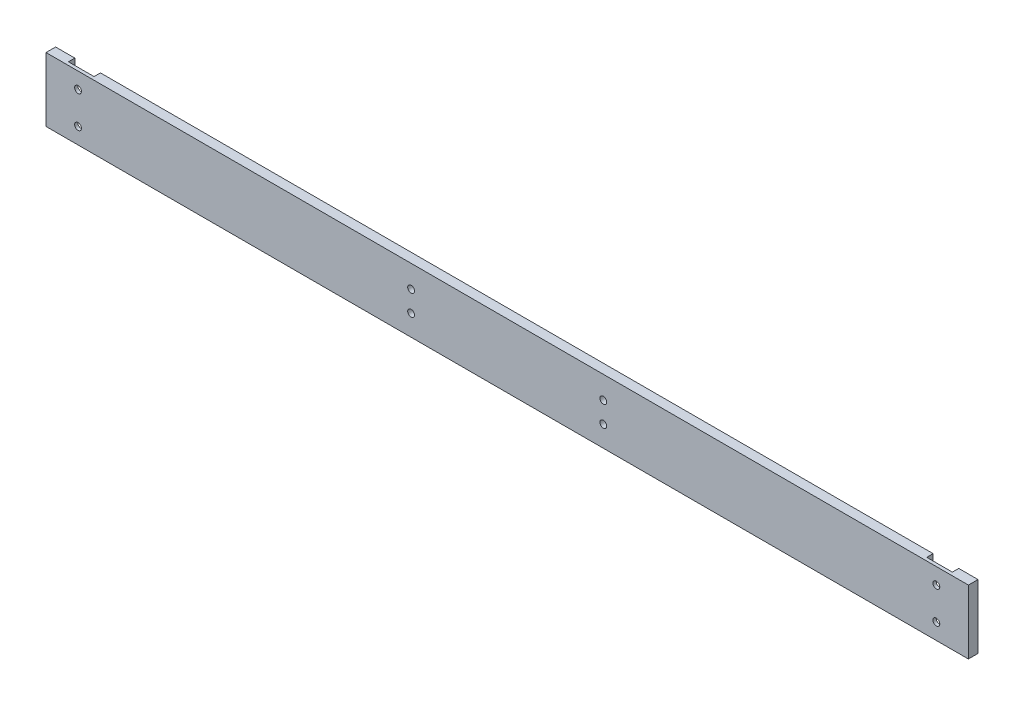
ISO-10303-21;
HEADER;
FILE_DESCRIPTION(('STEP AP214'),'2;1');
FILE_NAME('part.step','',(''),(''),'','','');
FILE_SCHEMA(('AUTOMOTIVE_DESIGN { 1 0 10303 214 1 1 1 1 }'));
ENDSEC;
DATA;
#1=APPLICATION_CONTEXT('core data for automotive mechanical design processes');
#2=APPLICATION_PROTOCOL_DEFINITION('international standard','automotive_design',2000,#1);
#3=PRODUCT_CONTEXT('',#1,'mechanical');
#4=PRODUCT('Part','Part','',(#3));
#5=PRODUCT_RELATED_PRODUCT_CATEGORY('part','',(#4));
#6=PRODUCT_DEFINITION_FORMATION('','',#4);
#7=PRODUCT_DEFINITION_CONTEXT('part definition',#1,'design');
#8=PRODUCT_DEFINITION('design','',#6,#7);
#9=PRODUCT_DEFINITION_SHAPE('','',#8);
#10=(LENGTH_UNIT() NAMED_UNIT(*) SI_UNIT(.MILLI.,.METRE.));
#11=(NAMED_UNIT(*) PLANE_ANGLE_UNIT() SI_UNIT($,.RADIAN.));
#12=(NAMED_UNIT(*) SI_UNIT($,.STERADIAN.) SOLID_ANGLE_UNIT());
#13=UNCERTAINTY_MEASURE_WITH_UNIT(LENGTH_MEASURE(1.E-05),#10,'distance_accuracy_value','');
#14=(GEOMETRIC_REPRESENTATION_CONTEXT(3) GLOBAL_UNCERTAINTY_ASSIGNED_CONTEXT((#13)) GLOBAL_UNIT_ASSIGNED_CONTEXT((#10,
#11,#12)) REPRESENTATION_CONTEXT('',''));
#15=CARTESIAN_POINT('',(0.,0.,0.));
#16=DIRECTION('',(0.,0.,1.));
#17=DIRECTION('',(1.,0.,0.));
#18=AXIS2_PLACEMENT_3D('',#15,#16,#17);
#19=CARTESIAN_POINT('',(-457.2,63.5,0.));
#20=DIRECTION('',(0.,0.,-1.));
#21=DIRECTION('',(-1.,0.,0.));
#22=AXIS2_PLACEMENT_3D('',#19,#20,#21);
#23=PLANE('',#22);
#24=CARTESIAN_POINT('',(-425.45,47.625,0.));
#25=DIRECTION('',(0.,0.,1.));
#26=DIRECTION('',(1.,0.,0.));
#27=AXIS2_PLACEMENT_3D('',#24,#25,#26);
#28=CIRCLE('',#27,3.3782);
#29=CARTESIAN_POINT('',(-422.0718,47.625,0.));
#30=VERTEX_POINT('',#29);
#31=EDGE_CURVE('E457',#30,#30,#28,.T.);
#32=ORIENTED_EDGE('',*,*,#31,.F.);
#33=EDGE_LOOP('',(#32));
#34=FACE_BOUND('',#33,.T.);
#35=CARTESIAN_POINT('',(425.45,15.875,0.));
#36=DIRECTION('',(0.,0.,1.));
#37=DIRECTION('',(1.,0.,0.));
#38=AXIS2_PLACEMENT_3D('',#35,#36,#37);
#39=CIRCLE('',#38,3.3782);
#40=CARTESIAN_POINT('',(428.8282,15.875,0.));
#41=VERTEX_POINT('',#40);
#42=EDGE_CURVE('E154',#41,#41,#39,.T.);
#43=ORIENTED_EDGE('',*,*,#42,.F.);
#44=EDGE_LOOP('',(#43));
#45=FACE_BOUND('',#44,.T.);
#46=CARTESIAN_POINT('',(-95.25,41.275,0.));
#47=DIRECTION('',(0.,0.,1.));
#48=DIRECTION('',(1.,0.,0.));
#49=AXIS2_PLACEMENT_3D('',#46,#47,#48);
#50=CIRCLE('',#49,3.37819999999998);
#51=CARTESIAN_POINT('',(-91.8718,41.275,0.));
#52=VERTEX_POINT('',#51);
#53=EDGE_CURVE('E160',#52,#52,#50,.T.);
#54=ORIENTED_EDGE('',*,*,#53,.F.);
#55=EDGE_LOOP('',(#54));
#56=FACE_BOUND('',#55,.T.);
#57=CARTESIAN_POINT('',(-95.25,20.6375,0.));
#58=DIRECTION('',(0.,0.,1.));
#59=DIRECTION('',(1.,0.,0.));
#60=AXIS2_PLACEMENT_3D('',#57,#58,#59);
#61=CIRCLE('',#60,3.37819999999998);
#62=CARTESIAN_POINT('',(-91.8718,20.6375,0.));
#63=VERTEX_POINT('',#62);
#64=EDGE_CURVE('E166',#63,#63,#61,.T.);
#65=ORIENTED_EDGE('',*,*,#64,.F.);
#66=EDGE_LOOP('',(#65));
#67=FACE_BOUND('',#66,.T.);
#68=CARTESIAN_POINT('',(95.25,41.275,0.));
#69=DIRECTION('',(0.,0.,1.));
#70=DIRECTION('',(1.,0.,0.));
#71=AXIS2_PLACEMENT_3D('',#68,#69,#70);
#72=CIRCLE('',#71,3.37819999999998);
#73=CARTESIAN_POINT('',(98.6282,41.275,0.));
#74=VERTEX_POINT('',#73);
#75=EDGE_CURVE('E172',#74,#74,#72,.T.);
#76=ORIENTED_EDGE('',*,*,#75,.F.);
#77=EDGE_LOOP('',(#76));
#78=FACE_BOUND('',#77,.T.);
#79=CARTESIAN_POINT('',(95.25,20.6375,0.));
#80=DIRECTION('',(0.,0.,1.));
#81=DIRECTION('',(1.,0.,0.));
#82=AXIS2_PLACEMENT_3D('',#79,#80,#81);
#83=CIRCLE('',#82,3.37819999999998);
#84=CARTESIAN_POINT('',(98.6282,20.6375,0.));
#85=VERTEX_POINT('',#84);
#86=EDGE_CURVE('E178',#85,#85,#83,.T.);
#87=ORIENTED_EDGE('',*,*,#86,.F.);
#88=EDGE_LOOP('',(#87));
#89=FACE_BOUND('',#88,.T.);
#90=CARTESIAN_POINT('',(425.45,47.625,0.));
#91=DIRECTION('',(0.,0.,1.));
#92=DIRECTION('',(1.,0.,0.));
#93=AXIS2_PLACEMENT_3D('',#90,#91,#92);
#94=CIRCLE('',#93,3.3782);
#95=CARTESIAN_POINT('',(428.8282,47.625,0.));
#96=VERTEX_POINT('',#95);
#97=EDGE_CURVE('E184',#96,#96,#94,.T.);
#98=ORIENTED_EDGE('',*,*,#97,.F.);
#99=EDGE_LOOP('',(#98));
#100=FACE_BOUND('',#99,.T.);
#101=DIRECTION('',(1.,0.,0.));
#102=VECTOR('',#101,1.);
#103=CARTESIAN_POINT('',(-457.2,0.,0.));
#104=LINE('',#103,#102);
#105=CARTESIAN_POINT('',(-457.2,0.,0.));
#106=VERTEX_POINT('',#105);
#107=CARTESIAN_POINT('',(457.2,0.,0.));
#108=VERTEX_POINT('',#107);
#109=EDGE_CURVE('E219',#106,#108,#104,.T.);
#110=ORIENTED_EDGE('',*,*,#109,.T.);
#111=DIRECTION('',(0.,-1.,0.));
#112=VECTOR('',#111,1.);
#113=CARTESIAN_POINT('',(457.2,63.5,0.));
#114=LINE('',#113,#112);
#115=CARTESIAN_POINT('',(457.2,63.5,0.));
#116=VERTEX_POINT('',#115);
#117=EDGE_CURVE('E44',#116,#108,#114,.T.);
#118=ORIENTED_EDGE('',*,*,#117,.F.);
#119=DIRECTION('',(1.,0.,0.));
#120=VECTOR('',#119,1.);
#121=CARTESIAN_POINT('',(-457.2,63.5,0.));
#122=LINE('',#121,#120);
#123=CARTESIAN_POINT('',(-457.2,63.5,0.));
#124=VERTEX_POINT('',#123);
#125=EDGE_CURVE('E227',#124,#116,#122,.T.);
#126=ORIENTED_EDGE('',*,*,#125,.F.);
#127=DIRECTION('',(0.,-1.,0.));
#128=VECTOR('',#127,1.);
#129=CARTESIAN_POINT('',(-457.2,63.5,0.));
#130=LINE('',#129,#128);
#131=EDGE_CURVE('E11',#124,#106,#130,.T.);
#132=ORIENTED_EDGE('',*,*,#131,.T.);
#133=EDGE_LOOP('',(#110,#118,#126,#132));
#134=FACE_BOUND('',#133,.T.);
#135=CARTESIAN_POINT('',(-425.45,15.875,0.));
#136=DIRECTION('',(0.,0.,1.));
#137=DIRECTION('',(1.,0.,0.));
#138=AXIS2_PLACEMENT_3D('',#135,#136,#137);
#139=CIRCLE('',#138,3.3782);
#140=CARTESIAN_POINT('',(-422.0718,15.875,0.));
#141=VERTEX_POINT('',#140);
#142=EDGE_CURVE('E453',#141,#141,#139,.T.);
#143=ORIENTED_EDGE('',*,*,#142,.F.);
#144=EDGE_LOOP('',(#143));
#145=FACE_BOUND('',#144,.T.);
#146=ADVANCED_FACE('F35',(#34,#45,#56,#67,#78,#89,#100,#134,#145),#23,.F.);
#147=CARTESIAN_POINT('',(-457.2,63.5,-9.52500000000001));
#148=DIRECTION('',(0.,0.,-1.));
#149=DIRECTION('',(-1.,0.,0.));
#150=AXIS2_PLACEMENT_3D('',#147,#148,#149);
#151=PLANE('',#150);
#152=CARTESIAN_POINT('',(-95.25,41.275,-9.52500000000001));
#153=DIRECTION('',(0.,0.,1.));
#154=DIRECTION('',(1.,0.,0.));
#155=AXIS2_PLACEMENT_3D('',#152,#153,#154);
#156=CIRCLE('',#155,3.37819999999997);
#157=CARTESIAN_POINT('',(-91.8718,41.275,-9.52500000000001));
#158=VERTEX_POINT('',#157);
#159=EDGE_CURVE('E163',#158,#158,#156,.T.);
#160=ORIENTED_EDGE('',*,*,#159,.T.);
#161=EDGE_LOOP('',(#160));
#162=FACE_BOUND('',#161,.T.);
#163=CARTESIAN_POINT('',(-95.25,20.6375,-9.52500000000001));
#164=DIRECTION('',(0.,0.,1.));
#165=DIRECTION('',(1.,0.,0.));
#166=AXIS2_PLACEMENT_3D('',#163,#164,#165);
#167=CIRCLE('',#166,3.37819999999997);
#168=CARTESIAN_POINT('',(-91.8718,20.6375,-9.52500000000001));
#169=VERTEX_POINT('',#168);
#170=EDGE_CURVE('E169',#169,#169,#167,.T.);
#171=ORIENTED_EDGE('',*,*,#170,.T.);
#172=EDGE_LOOP('',(#171));
#173=FACE_BOUND('',#172,.T.);
#174=CARTESIAN_POINT('',(95.25,41.275,-9.52500000000001));
#175=DIRECTION('',(0.,0.,1.));
#176=DIRECTION('',(1.,0.,0.));
#177=AXIS2_PLACEMENT_3D('',#174,#175,#176);
#178=CIRCLE('',#177,3.37819999999997);
#179=CARTESIAN_POINT('',(98.6282,41.275,-9.52500000000001));
#180=VERTEX_POINT('',#179);
#181=EDGE_CURVE('E175',#180,#180,#178,.T.);
#182=ORIENTED_EDGE('',*,*,#181,.T.);
#183=EDGE_LOOP('',(#182));
#184=FACE_BOUND('',#183,.T.);
#185=CARTESIAN_POINT('',(95.25,20.6375,-9.52500000000001));
#186=DIRECTION('',(0.,0.,1.));
#187=DIRECTION('',(1.,0.,0.));
#188=AXIS2_PLACEMENT_3D('',#185,#186,#187);
#189=CIRCLE('',#188,3.37819999999997);
#190=CARTESIAN_POINT('',(98.6282,20.6375,-9.52500000000001));
#191=VERTEX_POINT('',#190);
#192=EDGE_CURVE('E181',#191,#191,#189,.T.);
#193=ORIENTED_EDGE('',*,*,#192,.T.);
#194=EDGE_LOOP('',(#193));
#195=FACE_BOUND('',#194,.T.);
#196=DIRECTION('',(1.,0.,0.));
#197=VECTOR('',#196,1.);
#198=CARTESIAN_POINT('',(-457.2,0.,-9.52500000000001));
#199=LINE('',#198,#197);
#200=CARTESIAN_POINT('',(-412.75,0.,-9.525));
#201=VERTEX_POINT('',#200);
#202=CARTESIAN_POINT('',(412.75,0.,-9.525));
#203=VERTEX_POINT('',#202);
#204=EDGE_CURVE('E234',#201,#203,#199,.T.);
#205=ORIENTED_EDGE('',*,*,#204,.F.);
#206=DIRECTION('',(0.,1.,0.));
#207=VECTOR('',#206,1.);
#208=CARTESIAN_POINT('',(-412.75,0.,-9.525));
#209=LINE('',#208,#207);
#210=CARTESIAN_POINT('',(-412.75,63.5,-9.525));
#211=VERTEX_POINT('',#210);
#212=EDGE_CURVE('E268',#201,#211,#209,.T.);
#213=ORIENTED_EDGE('',*,*,#212,.T.);
#214=DIRECTION('',(1.,0.,0.));
#215=VECTOR('',#214,1.);
#216=CARTESIAN_POINT('',(-457.2,63.5,-9.52500000000001));
#217=LINE('',#216,#215);
#218=CARTESIAN_POINT('',(412.75,63.5,-9.525));
#219=VERTEX_POINT('',#218);
#220=EDGE_CURVE('E224',#211,#219,#217,.T.);
#221=ORIENTED_EDGE('',*,*,#220,.T.);
#222=DIRECTION('',(0.,1.,0.));
#223=VECTOR('',#222,1.);
#224=CARTESIAN_POINT('',(412.75,0.,-9.525));
#225=LINE('',#224,#223);
#226=EDGE_CURVE('E190',#203,#219,#225,.T.);
#227=ORIENTED_EDGE('',*,*,#226,.F.);
#228=EDGE_LOOP('',(#205,#213,#221,#227));
#229=FACE_BOUND('',#228,.T.);
#230=ADVANCED_FACE('F276',(#162,#173,#184,#195,#229),#151,.T.);
#231=CARTESIAN_POINT('',(-457.2,63.5,-9.52500000000001));
#232=VERTEX_POINT('',#231);
#233=CARTESIAN_POINT('',(-438.15,63.5,-9.525));
#234=VERTEX_POINT('',#233);
#235=EDGE_CURVE('E220',#232,#234,#217,.T.);
#236=ORIENTED_EDGE('',*,*,#235,.T.);
#237=DIRECTION('',(0.,-1.,0.));
#238=VECTOR('',#237,1.);
#239=CARTESIAN_POINT('',(-438.15,0.,-9.525));
#240=LINE('',#239,#238);
#241=CARTESIAN_POINT('',(-438.15,0.,-9.525));
#242=VERTEX_POINT('',#241);
#243=EDGE_CURVE('E250',#234,#242,#240,.T.);
#244=ORIENTED_EDGE('',*,*,#243,.T.);
#245=CARTESIAN_POINT('',(-457.2,0.,-9.52500000000001));
#246=VERTEX_POINT('',#245);
#247=EDGE_CURVE('E146',#246,#242,#199,.T.);
#248=ORIENTED_EDGE('',*,*,#247,.F.);
#249=DIRECTION('',(0.,-1.,0.));
#250=VECTOR('',#249,1.);
#251=CARTESIAN_POINT('',(-457.2,63.5,-9.52500000000001));
#252=LINE('',#251,#250);
#253=EDGE_CURVE('E39',#232,#246,#252,.T.);
#254=ORIENTED_EDGE('',*,*,#253,.F.);
#255=EDGE_LOOP('',(#236,#244,#248,#254));
#256=FACE_BOUND('',#255,.T.);
#257=ADVANCED_FACE('F249',(#256),#151,.T.);
#258=CARTESIAN_POINT('',(0.,63.5,0.));
#259=DIRECTION('',(0.,-1.,0.));
#260=DIRECTION('',(0.,0.,-1.));
#261=AXIS2_PLACEMENT_3D('',#258,#259,#260);
#262=PLANE('',#261);
#263=DIRECTION('',(0.,0.,-1.));
#264=VECTOR('',#263,1.);
#265=CARTESIAN_POINT('',(-412.75,63.5,-3.175));
#266=LINE('',#265,#264);
#267=CARTESIAN_POINT('',(-412.75,63.5,-3.175));
#268=VERTEX_POINT('',#267);
#269=EDGE_CURVE('E149',#268,#211,#266,.T.);
#270=ORIENTED_EDGE('',*,*,#269,.F.);
#271=DIRECTION('',(-1.,0.,0.));
#272=VECTOR('',#271,1.);
#273=CARTESIAN_POINT('',(-412.75,63.5,-3.175));
#274=LINE('',#273,#272);
#275=CARTESIAN_POINT('',(-438.15,63.5,-3.175));
#276=VERTEX_POINT('',#275);
#277=EDGE_CURVE('E134',#268,#276,#274,.T.);
#278=ORIENTED_EDGE('',*,*,#277,.T.);
#279=DIRECTION('',(0.,0.,-1.));
#280=VECTOR('',#279,1.);
#281=CARTESIAN_POINT('',(-438.15,63.5,-3.175));
#282=LINE('',#281,#280);
#283=EDGE_CURVE('E132',#276,#234,#282,.T.);
#284=ORIENTED_EDGE('',*,*,#283,.T.);
#285=ORIENTED_EDGE('',*,*,#235,.F.);
#286=DIRECTION('',(0.,0.,-1.));
#287=VECTOR('',#286,1.);
#288=CARTESIAN_POINT('',(-457.2,63.5,0.));
#289=LINE('',#288,#287);
#290=EDGE_CURVE('E215',#124,#232,#289,.T.);
#291=ORIENTED_EDGE('',*,*,#290,.F.);
#292=ORIENTED_EDGE('',*,*,#125,.T.);
#293=DIRECTION('',(0.,0.,-1.));
#294=VECTOR('',#293,1.);
#295=CARTESIAN_POINT('',(457.2,63.5,0.));
#296=LINE('',#295,#294);
#297=CARTESIAN_POINT('',(457.2,63.5,-9.52500000000001));
#298=VERTEX_POINT('',#297);
#299=EDGE_CURVE('E223',#116,#298,#296,.T.);
#300=ORIENTED_EDGE('',*,*,#299,.T.);
#301=CARTESIAN_POINT('',(438.15,63.5,-9.525));
#302=VERTEX_POINT('',#301);
#303=EDGE_CURVE('E218',#302,#298,#217,.T.);
#304=ORIENTED_EDGE('',*,*,#303,.F.);
#305=DIRECTION('',(0.,0.,-1.));
#306=VECTOR('',#305,1.);
#307=CARTESIAN_POINT('',(438.15,63.5,-3.175));
#308=LINE('',#307,#306);
#309=CARTESIAN_POINT('',(438.15,63.5,-3.175));
#310=VERTEX_POINT('',#309);
#311=EDGE_CURVE('E211',#310,#302,#308,.T.);
#312=ORIENTED_EDGE('',*,*,#311,.F.);
#313=DIRECTION('',(1.,0.,0.));
#314=VECTOR('',#313,1.);
#315=CARTESIAN_POINT('',(412.75,63.5,-3.175));
#316=LINE('',#315,#314);
#317=CARTESIAN_POINT('',(412.75,63.5,-3.175));
#318=VERTEX_POINT('',#317);
#319=EDGE_CURVE('E194',#318,#310,#316,.T.);
#320=ORIENTED_EDGE('',*,*,#319,.F.);
#321=DIRECTION('',(0.,0.,-1.));
#322=VECTOR('',#321,1.);
#323=CARTESIAN_POINT('',(412.75,63.5,-3.175));
#324=LINE('',#323,#322);
#325=EDGE_CURVE('E200',#318,#219,#324,.T.);
#326=ORIENTED_EDGE('',*,*,#325,.T.);
#327=ORIENTED_EDGE('',*,*,#220,.F.);
#328=EDGE_LOOP('',(#270,#278,#284,#285,#291,#292,#300,#304,#312,#320,#326,#327));
#329=FACE_BOUND('',#328,.T.);
#330=ADVANCED_FACE('F263',(#329),#262,.F.);
#331=CARTESIAN_POINT('',(0.,0.,0.));
#332=DIRECTION('',(0.,-1.,0.));
#333=DIRECTION('',(0.,0.,-1.));
#334=AXIS2_PLACEMENT_3D('',#331,#332,#333);
#335=PLANE('',#334);
#336=DIRECTION('',(1.,0.,0.));
#337=VECTOR('',#336,1.);
#338=CARTESIAN_POINT('',(-412.75,0.,-3.175));
#339=LINE('',#338,#337);
#340=CARTESIAN_POINT('',(-438.15,0.,-3.175));
#341=VERTEX_POINT('',#340);
#342=CARTESIAN_POINT('',(-412.75,0.,-3.175));
#343=VERTEX_POINT('',#342);
#344=EDGE_CURVE('E135',#341,#343,#339,.T.);
#345=ORIENTED_EDGE('',*,*,#344,.T.);
#346=DIRECTION('',(0.,0.,-1.));
#347=VECTOR('',#346,1.);
#348=CARTESIAN_POINT('',(-412.75,0.,-3.175));
#349=LINE('',#348,#347);
#350=EDGE_CURVE('E147',#343,#201,#349,.T.);
#351=ORIENTED_EDGE('',*,*,#350,.T.);
#352=ORIENTED_EDGE('',*,*,#204,.T.);
#353=DIRECTION('',(0.,0.,-1.));
#354=VECTOR('',#353,1.);
#355=CARTESIAN_POINT('',(412.75,0.,-3.175));
#356=LINE('',#355,#354);
#357=CARTESIAN_POINT('',(412.75,0.,-3.175));
#358=VERTEX_POINT('',#357);
#359=EDGE_CURVE('E204',#358,#203,#356,.T.);
#360=ORIENTED_EDGE('',*,*,#359,.F.);
#361=DIRECTION('',(-1.,0.,0.));
#362=VECTOR('',#361,1.);
#363=CARTESIAN_POINT('',(412.75,0.,-3.175));
#364=LINE('',#363,#362);
#365=CARTESIAN_POINT('',(438.15,0.,-3.175));
#366=VERTEX_POINT('',#365);
#367=EDGE_CURVE('E198',#366,#358,#364,.T.);
#368=ORIENTED_EDGE('',*,*,#367,.F.);
#369=DIRECTION('',(0.,0.,-1.));
#370=VECTOR('',#369,1.);
#371=CARTESIAN_POINT('',(438.15,0.,-3.175));
#372=LINE('',#371,#370);
#373=CARTESIAN_POINT('',(438.15,0.,-9.525));
#374=VERTEX_POINT('',#373);
#375=EDGE_CURVE('E208',#366,#374,#372,.T.);
#376=ORIENTED_EDGE('',*,*,#375,.T.);
#377=CARTESIAN_POINT('',(457.2,0.,-9.52500000000001));
#378=VERTEX_POINT('',#377);
#379=EDGE_CURVE('E231',#374,#378,#199,.T.);
#380=ORIENTED_EDGE('',*,*,#379,.T.);
#381=DIRECTION('',(0.,0.,-1.));
#382=VECTOR('',#381,1.);
#383=CARTESIAN_POINT('',(457.2,0.,0.));
#384=LINE('',#383,#382);
#385=EDGE_CURVE('E233',#108,#378,#384,.T.);
#386=ORIENTED_EDGE('',*,*,#385,.F.);
#387=ORIENTED_EDGE('',*,*,#109,.F.);
#388=DIRECTION('',(0.,0.,-1.));
#389=VECTOR('',#388,1.);
#390=CARTESIAN_POINT('',(-457.2,0.,0.));
#391=LINE('',#390,#389);
#392=EDGE_CURVE('E207',#106,#246,#391,.T.);
#393=ORIENTED_EDGE('',*,*,#392,.T.);
#394=ORIENTED_EDGE('',*,*,#247,.T.);
#395=DIRECTION('',(0.,0.,-1.));
#396=VECTOR('',#395,1.);
#397=CARTESIAN_POINT('',(-438.15,0.,-3.175));
#398=LINE('',#397,#396);
#399=EDGE_CURVE('E129',#341,#242,#398,.T.);
#400=ORIENTED_EDGE('',*,*,#399,.F.);
#401=EDGE_LOOP('',(#345,#351,#352,#360,#368,#376,#380,#386,#387,#393,#394,#400));
#402=FACE_BOUND('',#401,.T.);
#403=ADVANCED_FACE('F143',(#402),#335,.T.);
#404=CARTESIAN_POINT('',(-457.2,63.5,0.));
#405=DIRECTION('',(-1.,0.,0.));
#406=DIRECTION('',(0.,0.,1.));
#407=AXIS2_PLACEMENT_3D('',#404,#405,#406);
#408=PLANE('',#407);
#409=ORIENTED_EDGE('',*,*,#392,.F.);
#410=ORIENTED_EDGE('',*,*,#131,.F.);
#411=ORIENTED_EDGE('',*,*,#290,.T.);
#412=ORIENTED_EDGE('',*,*,#253,.T.);
#413=EDGE_LOOP('',(#409,#410,#411,#412));
#414=FACE_BOUND('',#413,.T.);
#415=ADVANCED_FACE('F37',(#414),#408,.T.);
#416=CARTESIAN_POINT('',(457.2,63.5,0.));
#417=DIRECTION('',(-1.,0.,0.));
#418=DIRECTION('',(0.,0.,1.));
#419=AXIS2_PLACEMENT_3D('',#416,#417,#418);
#420=PLANE('',#419);
#421=ORIENTED_EDGE('',*,*,#385,.T.);
#422=DIRECTION('',(0.,-1.,0.));
#423=VECTOR('',#422,1.);
#424=CARTESIAN_POINT('',(457.2,63.5,-9.52500000000001));
#425=LINE('',#424,#423);
#426=EDGE_CURVE('E239',#298,#378,#425,.T.);
#427=ORIENTED_EDGE('',*,*,#426,.F.);
#428=ORIENTED_EDGE('',*,*,#299,.F.);
#429=ORIENTED_EDGE('',*,*,#117,.T.);
#430=EDGE_LOOP('',(#421,#427,#428,#429));
#431=FACE_BOUND('',#430,.T.);
#432=ADVANCED_FACE('F259',(#431),#420,.F.);
#433=DIRECTION('',(0.,-1.,0.));
#434=VECTOR('',#433,1.);
#435=CARTESIAN_POINT('',(438.15,0.,-9.525));
#436=LINE('',#435,#434);
#437=EDGE_CURVE('E195',#302,#374,#436,.T.);
#438=ORIENTED_EDGE('',*,*,#437,.F.);
#439=ORIENTED_EDGE('',*,*,#303,.T.);
#440=ORIENTED_EDGE('',*,*,#426,.T.);
#441=ORIENTED_EDGE('',*,*,#379,.F.);
#442=EDGE_LOOP('',(#438,#439,#440,#441));
#443=FACE_BOUND('',#442,.T.);
#444=ADVANCED_FACE('F281',(#443),#151,.T.);
#445=CARTESIAN_POINT('',(412.75,0.,-3.175));
#446=DIRECTION('',(-1.,0.,0.));
#447=DIRECTION('',(0.,-1.,0.));
#448=AXIS2_PLACEMENT_3D('',#445,#446,#447);
#449=PLANE('',#448);
#450=ORIENTED_EDGE('',*,*,#226,.T.);
#451=ORIENTED_EDGE('',*,*,#325,.F.);
#452=DIRECTION('',(0.,1.,0.));
#453=VECTOR('',#452,1.);
#454=CARTESIAN_POINT('',(412.75,0.,-3.175));
#455=LINE('',#454,#453);
#456=EDGE_CURVE('E191',#358,#318,#455,.T.);
#457=ORIENTED_EDGE('',*,*,#456,.F.);
#458=ORIENTED_EDGE('',*,*,#359,.T.);
#459=EDGE_LOOP('',(#450,#451,#457,#458));
#460=FACE_BOUND('',#459,.T.);
#461=ADVANCED_FACE('F288',(#460),#449,.F.);
#462=CARTESIAN_POINT('',(438.15,0.,-3.175));
#463=DIRECTION('',(1.,0.,0.));
#464=DIRECTION('',(0.,0.,-1.));
#465=AXIS2_PLACEMENT_3D('',#462,#463,#464);
#466=PLANE('',#465);
#467=ORIENTED_EDGE('',*,*,#437,.T.);
#468=ORIENTED_EDGE('',*,*,#375,.F.);
#469=DIRECTION('',(0.,-1.,0.));
#470=VECTOR('',#469,1.);
#471=CARTESIAN_POINT('',(438.15,0.,-3.175));
#472=LINE('',#471,#470);
#473=EDGE_CURVE('E60',#310,#366,#472,.T.);
#474=ORIENTED_EDGE('',*,*,#473,.F.);
#475=ORIENTED_EDGE('',*,*,#311,.T.);
#476=EDGE_LOOP('',(#467,#468,#474,#475));
#477=FACE_BOUND('',#476,.T.);
#478=ADVANCED_FACE('F283',(#477),#466,.F.);
#479=CARTESIAN_POINT('',(0.,0.,-3.175));
#480=DIRECTION('',(0.,0.,-1.));
#481=DIRECTION('',(-1.,0.,0.));
#482=AXIS2_PLACEMENT_3D('',#479,#480,#481);
#483=PLANE('',#482);
#484=CARTESIAN_POINT('',(425.45,15.875,-3.175));
#485=DIRECTION('',(0.,0.,-1.));
#486=DIRECTION('',(-1.,0.,0.));
#487=AXIS2_PLACEMENT_3D('',#484,#485,#486);
#488=CIRCLE('',#487,3.3782);
#489=CARTESIAN_POINT('',(422.0718,15.875,-3.175));
#490=VERTEX_POINT('',#489);
#491=EDGE_CURVE('E157',#490,#490,#488,.T.);
#492=ORIENTED_EDGE('',*,*,#491,.F.);
#493=EDGE_LOOP('',(#492));
#494=FACE_BOUND('',#493,.T.);
#495=CARTESIAN_POINT('',(425.45,47.625,-3.175));
#496=DIRECTION('',(0.,0.,-1.));
#497=DIRECTION('',(-1.,0.,0.));
#498=AXIS2_PLACEMENT_3D('',#495,#496,#497);
#499=CIRCLE('',#498,3.3782);
#500=CARTESIAN_POINT('',(422.0718,47.625,-3.175));
#501=VERTEX_POINT('',#500);
#502=EDGE_CURVE('E187',#501,#501,#499,.T.);
#503=ORIENTED_EDGE('',*,*,#502,.F.);
#504=EDGE_LOOP('',(#503));
#505=FACE_BOUND('',#504,.T.);
#506=ORIENTED_EDGE('',*,*,#456,.T.);
#507=ORIENTED_EDGE('',*,*,#319,.T.);
#508=ORIENTED_EDGE('',*,*,#473,.T.);
#509=ORIENTED_EDGE('',*,*,#367,.T.);
#510=EDGE_LOOP('',(#506,#507,#508,#509));
#511=FACE_BOUND('',#510,.T.);
#512=ADVANCED_FACE('F286',(#494,#505,#511),#483,.T.);
#513=CARTESIAN_POINT('',(425.45,47.625,0.));
#514=DIRECTION('',(0.,0.,1.));
#515=DIRECTION('',(1.,0.,0.));
#516=AXIS2_PLACEMENT_3D('',#513,#514,#515);
#517=CYLINDRICAL_SURFACE('',#516,3.3782);
#518=ORIENTED_EDGE('',*,*,#97,.T.);
#519=EDGE_LOOP('',(#518));
#520=FACE_BOUND('',#519,.T.);
#521=ORIENTED_EDGE('',*,*,#502,.T.);
#522=EDGE_LOOP('',(#521));
#523=FACE_BOUND('',#522,.T.);
#524=ADVANCED_FACE('F358',(#520,#523),#517,.F.);
#525=CARTESIAN_POINT('',(95.25,20.6375,0.));
#526=DIRECTION('',(0.,0.,1.));
#527=DIRECTION('',(1.,0.,0.));
#528=AXIS2_PLACEMENT_3D('',#525,#526,#527);
#529=CYLINDRICAL_SURFACE('',#528,3.37819999999998);
#530=ORIENTED_EDGE('',*,*,#192,.F.);
#531=EDGE_LOOP('',(#530));
#532=FACE_BOUND('',#531,.T.);
#533=ORIENTED_EDGE('',*,*,#86,.T.);
#534=EDGE_LOOP('',(#533));
#535=FACE_BOUND('',#534,.T.);
#536=ADVANCED_FACE('F389',(#532,#535),#529,.F.);
#537=CARTESIAN_POINT('',(95.25,41.275,0.));
#538=DIRECTION('',(0.,0.,1.));
#539=DIRECTION('',(1.,0.,0.));
#540=AXIS2_PLACEMENT_3D('',#537,#538,#539);
#541=CYLINDRICAL_SURFACE('',#540,3.37819999999998);
#542=ORIENTED_EDGE('',*,*,#181,.F.);
#543=EDGE_LOOP('',(#542));
#544=FACE_BOUND('',#543,.T.);
#545=ORIENTED_EDGE('',*,*,#75,.T.);
#546=EDGE_LOOP('',(#545));
#547=FACE_BOUND('',#546,.T.);
#548=ADVANCED_FACE('F379',(#544,#547),#541,.F.);
#549=CARTESIAN_POINT('',(-95.25,20.6375,0.));
#550=DIRECTION('',(0.,0.,1.));
#551=DIRECTION('',(1.,0.,0.));
#552=AXIS2_PLACEMENT_3D('',#549,#550,#551);
#553=CYLINDRICAL_SURFACE('',#552,3.37819999999998);
#554=ORIENTED_EDGE('',*,*,#170,.F.);
#555=EDGE_LOOP('',(#554));
#556=FACE_BOUND('',#555,.T.);
#557=ORIENTED_EDGE('',*,*,#64,.T.);
#558=EDGE_LOOP('',(#557));
#559=FACE_BOUND('',#558,.T.);
#560=ADVANCED_FACE('F369',(#556,#559),#553,.F.);
#561=CARTESIAN_POINT('',(-95.25,41.275,0.));
#562=DIRECTION('',(0.,0.,1.));
#563=DIRECTION('',(1.,0.,0.));
#564=AXIS2_PLACEMENT_3D('',#561,#562,#563);
#565=CYLINDRICAL_SURFACE('',#564,3.37819999999998);
#566=ORIENTED_EDGE('',*,*,#159,.F.);
#567=EDGE_LOOP('',(#566));
#568=FACE_BOUND('',#567,.T.);
#569=ORIENTED_EDGE('',*,*,#53,.T.);
#570=EDGE_LOOP('',(#569));
#571=FACE_BOUND('',#570,.T.);
#572=ADVANCED_FACE('F344',(#568,#571),#565,.F.);
#573=CARTESIAN_POINT('',(425.45,15.875,0.));
#574=DIRECTION('',(0.,0.,1.));
#575=DIRECTION('',(1.,0.,0.));
#576=AXIS2_PLACEMENT_3D('',#573,#574,#575);
#577=CYLINDRICAL_SURFACE('',#576,3.3782);
#578=ORIENTED_EDGE('',*,*,#42,.T.);
#579=EDGE_LOOP('',(#578));
#580=FACE_BOUND('',#579,.T.);
#581=ORIENTED_EDGE('',*,*,#491,.T.);
#582=EDGE_LOOP('',(#581));
#583=FACE_BOUND('',#582,.T.);
#584=ADVANCED_FACE('F339',(#580,#583),#577,.F.);
#585=CARTESIAN_POINT('',(-412.75,0.,-3.175));
#586=DIRECTION('',(-1.,0.,0.));
#587=DIRECTION('',(0.,-1.,0.));
#588=AXIS2_PLACEMENT_3D('',#585,#586,#587);
#589=PLANE('',#588);
#590=ORIENTED_EDGE('',*,*,#212,.F.);
#591=ORIENTED_EDGE('',*,*,#350,.F.);
#592=DIRECTION('',(0.,1.,0.));
#593=VECTOR('',#592,1.);
#594=CARTESIAN_POINT('',(-412.75,0.,-3.175));
#595=LINE('',#594,#593);
#596=EDGE_CURVE('E52',#343,#268,#595,.T.);
#597=ORIENTED_EDGE('',*,*,#596,.T.);
#598=ORIENTED_EDGE('',*,*,#269,.T.);
#599=EDGE_LOOP('',(#590,#591,#597,#598));
#600=FACE_BOUND('',#599,.T.);
#601=ADVANCED_FACE('F273',(#600),#589,.T.);
#602=CARTESIAN_POINT('',(-438.15,0.,-3.175));
#603=DIRECTION('',(1.,0.,0.));
#604=DIRECTION('',(0.,0.,-1.));
#605=AXIS2_PLACEMENT_3D('',#602,#603,#604);
#606=PLANE('',#605);
#607=ORIENTED_EDGE('',*,*,#243,.F.);
#608=ORIENTED_EDGE('',*,*,#283,.F.);
#609=DIRECTION('',(0.,-1.,0.));
#610=VECTOR('',#609,1.);
#611=CARTESIAN_POINT('',(-438.15,0.,-3.175));
#612=LINE('',#611,#610);
#613=EDGE_CURVE('E126',#276,#341,#612,.T.);
#614=ORIENTED_EDGE('',*,*,#613,.T.);
#615=ORIENTED_EDGE('',*,*,#399,.T.);
#616=EDGE_LOOP('',(#607,#608,#614,#615));
#617=FACE_BOUND('',#616,.T.);
#618=ADVANCED_FACE('F127',(#617),#606,.T.);
#619=CARTESIAN_POINT('',(0.,0.,-3.175));
#620=DIRECTION('',(0.,0.,-1.));
#621=DIRECTION('',(1.,0.,0.));
#622=AXIS2_PLACEMENT_3D('',#619,#620,#621);
#623=PLANE('',#622);
#624=CARTESIAN_POINT('',(-425.45,15.875,-3.175));
#625=DIRECTION('',(0.,0.,-1.));
#626=DIRECTION('',(-1.,0.,0.));
#627=AXIS2_PLACEMENT_3D('',#624,#625,#626);
#628=CIRCLE('',#627,3.3782);
#629=CARTESIAN_POINT('',(-428.8282,15.875,-3.175));
#630=VERTEX_POINT('',#629);
#631=EDGE_CURVE('E456',#630,#630,#628,.T.);
#632=ORIENTED_EDGE('',*,*,#631,.F.);
#633=EDGE_LOOP('',(#632));
#634=FACE_BOUND('',#633,.T.);
#635=CARTESIAN_POINT('',(-425.45,47.625,-3.175));
#636=DIRECTION('',(0.,0.,-1.));
#637=DIRECTION('',(-1.,0.,0.));
#638=AXIS2_PLACEMENT_3D('',#635,#636,#637);
#639=CIRCLE('',#638,3.3782);
#640=CARTESIAN_POINT('',(-428.8282,47.625,-3.175));
#641=VERTEX_POINT('',#640);
#642=EDGE_CURVE('E271',#641,#641,#639,.T.);
#643=ORIENTED_EDGE('',*,*,#642,.F.);
#644=EDGE_LOOP('',(#643));
#645=FACE_BOUND('',#644,.T.);
#646=ORIENTED_EDGE('',*,*,#596,.F.);
#647=ORIENTED_EDGE('',*,*,#344,.F.);
#648=ORIENTED_EDGE('',*,*,#613,.F.);
#649=ORIENTED_EDGE('',*,*,#277,.F.);
#650=EDGE_LOOP('',(#646,#647,#648,#649));
#651=FACE_BOUND('',#650,.T.);
#652=ADVANCED_FACE('F138',(#634,#645,#651),#623,.T.);
#653=CARTESIAN_POINT('',(-425.45,47.625,0.));
#654=DIRECTION('',(0.,0.,1.));
#655=DIRECTION('',(1.,0.,0.));
#656=AXIS2_PLACEMENT_3D('',#653,#654,#655);
#657=CYLINDRICAL_SURFACE('',#656,3.3782);
#658=ORIENTED_EDGE('',*,*,#31,.T.);
#659=EDGE_LOOP('',(#658));
#660=FACE_BOUND('',#659,.T.);
#661=ORIENTED_EDGE('',*,*,#642,.T.);
#662=EDGE_LOOP('',(#661));
#663=FACE_BOUND('',#662,.T.);
#664=ADVANCED_FACE('F440',(#660,#663),#657,.F.);
#665=CARTESIAN_POINT('',(-425.45,15.875,0.));
#666=DIRECTION('',(0.,0.,1.));
#667=DIRECTION('',(1.,0.,0.));
#668=AXIS2_PLACEMENT_3D('',#665,#666,#667);
#669=CYLINDRICAL_SURFACE('',#668,3.3782);
#670=ORIENTED_EDGE('',*,*,#142,.T.);
#671=EDGE_LOOP('',(#670));
#672=FACE_BOUND('',#671,.T.);
#673=ORIENTED_EDGE('',*,*,#631,.T.);
#674=EDGE_LOOP('',(#673));
#675=FACE_BOUND('',#674,.T.);
#676=ADVANCED_FACE('F444',(#672,#675),#669,.F.);
#677=CLOSED_SHELL('',(#146,#230,#257,#330,#403,#415,#432,#444,#461,#478,#512,#524,#536,#548,
#560,#572,#584,#601,#618,#652,#664,#676));
#678=MANIFOLD_SOLID_BREP('B2',#677);
#679=ADVANCED_BREP_SHAPE_REPRESENTATION('',(#18,#678),#14);
#680=SHAPE_DEFINITION_REPRESENTATION(#9,#679);
ENDSEC;
END-ISO-10303-21;
